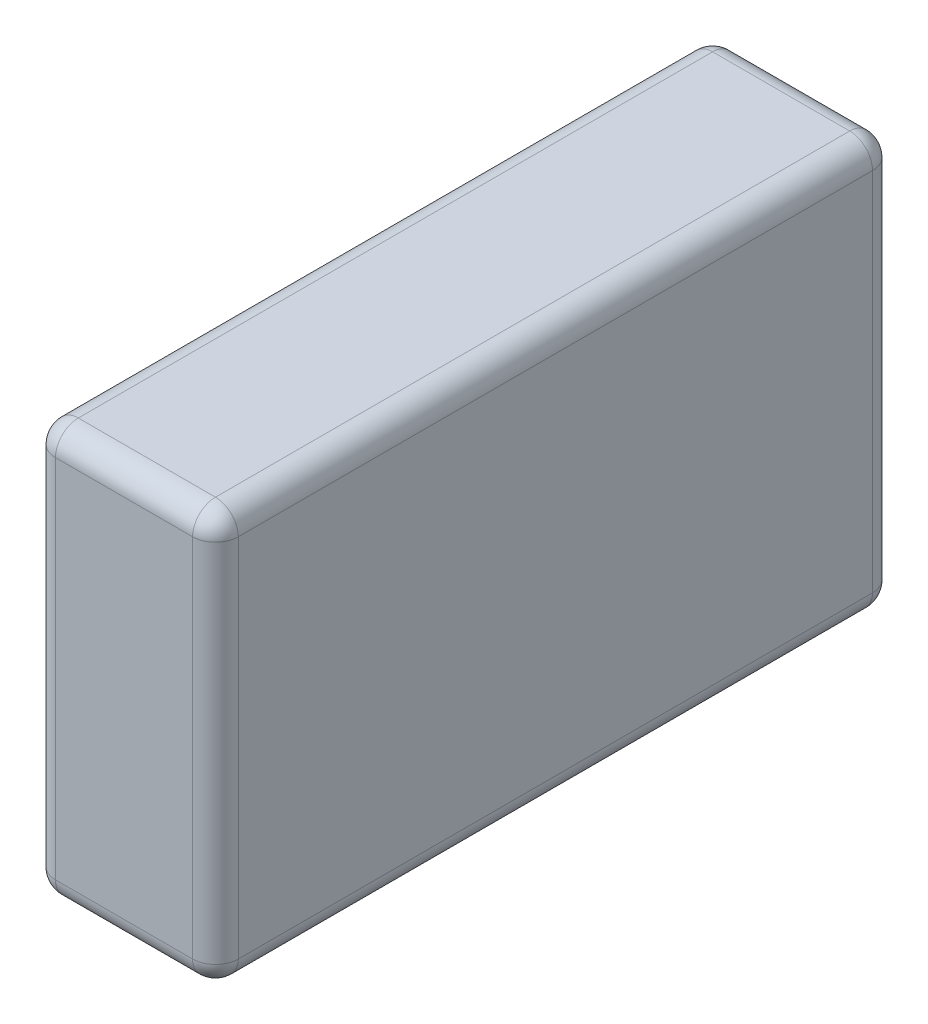
ISO-10303-21;
HEADER;
FILE_DESCRIPTION(('STEP AP214'),'2;1');
FILE_NAME('part.step','',(''),(''),'','','');
FILE_SCHEMA(('AUTOMOTIVE_DESIGN { 1 0 10303 214 1 1 1 1 }'));
ENDSEC;
DATA;
#1=APPLICATION_CONTEXT('core data for automotive mechanical design processes');
#2=APPLICATION_PROTOCOL_DEFINITION('international standard','automotive_design',2000,#1);
#3=PRODUCT_CONTEXT('',#1,'mechanical');
#4=PRODUCT('Part','Part','',(#3));
#5=PRODUCT_RELATED_PRODUCT_CATEGORY('part','',(#4));
#6=PRODUCT_DEFINITION_FORMATION('','',#4);
#7=PRODUCT_DEFINITION_CONTEXT('part definition',#1,'design');
#8=PRODUCT_DEFINITION('design','',#6,#7);
#9=PRODUCT_DEFINITION_SHAPE('','',#8);
#10=(LENGTH_UNIT() NAMED_UNIT(*) SI_UNIT(.MILLI.,.METRE.));
#11=(NAMED_UNIT(*) PLANE_ANGLE_UNIT() SI_UNIT($,.RADIAN.));
#12=(NAMED_UNIT(*) SI_UNIT($,.STERADIAN.) SOLID_ANGLE_UNIT());
#13=UNCERTAINTY_MEASURE_WITH_UNIT(LENGTH_MEASURE(1.E-05),#10,'distance_accuracy_value','');
#14=(GEOMETRIC_REPRESENTATION_CONTEXT(3) GLOBAL_UNCERTAINTY_ASSIGNED_CONTEXT((#13)) GLOBAL_UNIT_ASSIGNED_CONTEXT((#10,
#11,#12)) REPRESENTATION_CONTEXT('',''));
#15=CARTESIAN_POINT('',(0.,0.,0.));
#16=DIRECTION('',(0.,0.,1.));
#17=DIRECTION('',(1.,0.,0.));
#18=AXIS2_PLACEMENT_3D('',#15,#16,#17);
#19=CARTESIAN_POINT('',(32.,36.,59.));
#20=DIRECTION('',(0.,0.,-1.));
#21=DIRECTION('',(0.,1.,0.));
#22=AXIS2_PLACEMENT_3D('',#19,#20,#21);
#23=PLANE('',#22);
#24=DIRECTION('',(0.,-1.,0.));
#25=VECTOR('',#24,1.);
#26=CARTESIAN_POINT('',(4.,36.,59.));
#27=LINE('',#26,#25);
#28=CARTESIAN_POINT('',(4.,32.,59.));
#29=VERTEX_POINT('',#28);
#30=CARTESIAN_POINT('',(4.,-32.,59.));
#31=VERTEX_POINT('',#30);
#32=EDGE_CURVE('E336',#29,#31,#27,.T.);
#33=ORIENTED_EDGE('',*,*,#32,.T.);
#34=DIRECTION('',(-1.,0.,0.));
#35=VECTOR('',#34,1.);
#36=CARTESIAN_POINT('',(32.,-32.,59.));
#37=LINE('',#36,#35);
#38=CARTESIAN_POINT('',(28.,-32.,59.));
#39=VERTEX_POINT('',#38);
#40=EDGE_CURVE('E256',#31,#39,#37,.F.);
#41=ORIENTED_EDGE('',*,*,#40,.T.);
#42=DIRECTION('',(0.,-1.,0.));
#43=VECTOR('',#42,1.);
#44=CARTESIAN_POINT('',(28.,36.,59.));
#45=LINE('',#44,#43);
#46=CARTESIAN_POINT('',(28.,32.,59.));
#47=VERTEX_POINT('',#46);
#48=EDGE_CURVE('E243',#39,#47,#45,.F.);
#49=ORIENTED_EDGE('',*,*,#48,.T.);
#50=DIRECTION('',(-1.,0.,0.));
#51=VECTOR('',#50,1.);
#52=CARTESIAN_POINT('',(32.,32.,59.));
#53=LINE('',#52,#51);
#54=EDGE_CURVE('E331',#47,#29,#53,.T.);
#55=ORIENTED_EDGE('',*,*,#54,.T.);
#56=EDGE_LOOP('',(#33,#41,#49,#55));
#57=FACE_BOUND('',#56,.T.);
#58=ADVANCED_FACE('F45',(#57),#23,.F.);
#59=CARTESIAN_POINT('',(32.,-36.,59.));
#60=DIRECTION('',(0.,1.,0.));
#61=DIRECTION('',(0.,0.,1.));
#62=AXIS2_PLACEMENT_3D('',#59,#60,#61);
#63=PLANE('',#62);
#64=DIRECTION('',(0.,0.,-1.));
#65=VECTOR('',#64,1.);
#66=CARTESIAN_POINT('',(4.,-36.,59.));
#67=LINE('',#66,#65);
#68=CARTESIAN_POINT('',(4.,-36.,55.));
#69=VERTEX_POINT('',#68);
#70=CARTESIAN_POINT('',(4.,-36.,-56.));
#71=VERTEX_POINT('',#70);
#72=EDGE_CURVE('E309',#69,#71,#67,.T.);
#73=ORIENTED_EDGE('',*,*,#72,.T.);
#74=DIRECTION('',(-1.,0.,0.));
#75=VECTOR('',#74,1.);
#76=CARTESIAN_POINT('',(32.,-36.,-56.));
#77=LINE('',#76,#75);
#78=CARTESIAN_POINT('',(28.,-36.,-56.));
#79=VERTEX_POINT('',#78);
#80=EDGE_CURVE('E306',#71,#79,#77,.F.);
#81=ORIENTED_EDGE('',*,*,#80,.T.);
#82=DIRECTION('',(0.,0.,-1.));
#83=VECTOR('',#82,1.);
#84=CARTESIAN_POINT('',(28.,-36.,59.));
#85=LINE('',#84,#83);
#86=CARTESIAN_POINT('',(28.,-36.,55.));
#87=VERTEX_POINT('',#86);
#88=EDGE_CURVE('E297',#79,#87,#85,.F.);
#89=ORIENTED_EDGE('',*,*,#88,.T.);
#90=DIRECTION('',(-1.,0.,0.));
#91=VECTOR('',#90,1.);
#92=CARTESIAN_POINT('',(32.,-36.,55.));
#93=LINE('',#92,#91);
#94=EDGE_CURVE('E303',#87,#69,#93,.T.);
#95=ORIENTED_EDGE('',*,*,#94,.T.);
#96=EDGE_LOOP('',(#73,#81,#89,#95));
#97=FACE_BOUND('',#96,.T.);
#98=ADVANCED_FACE('F307',(#97),#63,.F.);
#99=CARTESIAN_POINT('',(32.,36.,-60.));
#100=DIRECTION('',(0.,0.,1.));
#101=DIRECTION('',(1.,0.,0.));
#102=AXIS2_PLACEMENT_3D('',#99,#100,#101);
#103=PLANE('',#102);
#104=DIRECTION('',(0.,1.,0.));
#105=VECTOR('',#104,1.);
#106=CARTESIAN_POINT('',(28.,-36.,-60.));
#107=LINE('',#106,#105);
#108=CARTESIAN_POINT('',(28.,32.,-60.));
#109=VERTEX_POINT('',#108);
#110=CARTESIAN_POINT('',(28.,-32.,-60.));
#111=VERTEX_POINT('',#110);
#112=EDGE_CURVE('E146',#109,#111,#107,.F.);
#113=ORIENTED_EDGE('',*,*,#112,.T.);
#114=DIRECTION('',(-1.,0.,0.));
#115=VECTOR('',#114,1.);
#116=CARTESIAN_POINT('',(32.,-32.,-60.));
#117=LINE('',#116,#115);
#118=CARTESIAN_POINT('',(4.,-32.,-60.));
#119=VERTEX_POINT('',#118);
#120=EDGE_CURVE('E141',#111,#119,#117,.T.);
#121=ORIENTED_EDGE('',*,*,#120,.T.);
#122=DIRECTION('',(0.,1.,0.));
#123=VECTOR('',#122,1.);
#124=CARTESIAN_POINT('',(4.,36.,-60.));
#125=LINE('',#124,#123);
#126=CARTESIAN_POINT('',(4.,32.,-60.));
#127=VERTEX_POINT('',#126);
#128=EDGE_CURVE('E135',#119,#127,#125,.T.);
#129=ORIENTED_EDGE('',*,*,#128,.T.);
#130=DIRECTION('',(-1.,0.,0.));
#131=VECTOR('',#130,1.);
#132=CARTESIAN_POINT('',(32.,32.,-60.));
#133=LINE('',#132,#131);
#134=EDGE_CURVE('E138',#127,#109,#133,.F.);
#135=ORIENTED_EDGE('',*,*,#134,.T.);
#136=EDGE_LOOP('',(#113,#121,#129,#135));
#137=FACE_BOUND('',#136,.T.);
#138=ADVANCED_FACE('F137',(#137),#103,.F.);
#139=CARTESIAN_POINT('',(32.,36.,59.));
#140=DIRECTION('',(0.,-1.,0.));
#141=DIRECTION('',(0.,0.,-1.));
#142=AXIS2_PLACEMENT_3D('',#139,#140,#141);
#143=PLANE('',#142);
#144=DIRECTION('',(0.,0.,1.));
#145=VECTOR('',#144,1.);
#146=CARTESIAN_POINT('',(28.,36.,-60.));
#147=LINE('',#146,#145);
#148=CARTESIAN_POINT('',(28.,36.,55.));
#149=VERTEX_POINT('',#148);
#150=CARTESIAN_POINT('',(28.,36.,-56.));
#151=VERTEX_POINT('',#150);
#152=EDGE_CURVE('E55',#149,#151,#147,.F.);
#153=ORIENTED_EDGE('',*,*,#152,.T.);
#154=DIRECTION('',(-1.,0.,0.));
#155=VECTOR('',#154,1.);
#156=CARTESIAN_POINT('',(32.,36.,-56.));
#157=LINE('',#156,#155);
#158=CARTESIAN_POINT('',(4.,36.,-56.));
#159=VERTEX_POINT('',#158);
#160=EDGE_CURVE('E11',#151,#159,#157,.T.);
#161=ORIENTED_EDGE('',*,*,#160,.T.);
#162=DIRECTION('',(0.,0.,1.));
#163=VECTOR('',#162,1.);
#164=CARTESIAN_POINT('',(4.,36.,59.));
#165=LINE('',#164,#163);
#166=CARTESIAN_POINT('',(4.,36.,55.));
#167=VERTEX_POINT('',#166);
#168=EDGE_CURVE('E263',#159,#167,#165,.T.);
#169=ORIENTED_EDGE('',*,*,#168,.T.);
#170=DIRECTION('',(-1.,0.,0.));
#171=VECTOR('',#170,1.);
#172=CARTESIAN_POINT('',(32.,36.,55.));
#173=LINE('',#172,#171);
#174=EDGE_CURVE('E66',#167,#149,#173,.F.);
#175=ORIENTED_EDGE('',*,*,#174,.T.);
#176=EDGE_LOOP('',(#153,#161,#169,#175));
#177=FACE_BOUND('',#176,.T.);
#178=ADVANCED_FACE('F442',(#177),#143,.F.);
#179=CARTESIAN_POINT('',(32.,0.,0.));
#180=DIRECTION('',(1.,0.,0.));
#181=DIRECTION('',(0.,0.,-1.));
#182=AXIS2_PLACEMENT_3D('',#179,#180,#181);
#183=PLANE('',#182);
#184=DIRECTION('',(0.,0.,-1.));
#185=VECTOR('',#184,1.);
#186=CARTESIAN_POINT('',(32.,-32.,-60.));
#187=LINE('',#186,#185);
#188=CARTESIAN_POINT('',(32.,-32.,55.));
#189=VERTEX_POINT('',#188);
#190=CARTESIAN_POINT('',(32.,-32.,-56.));
#191=VERTEX_POINT('',#190);
#192=EDGE_CURVE('E249',#189,#191,#187,.T.);
#193=ORIENTED_EDGE('',*,*,#192,.T.);
#194=DIRECTION('',(0.,1.,0.));
#195=VECTOR('',#194,1.);
#196=CARTESIAN_POINT('',(32.,36.,-56.));
#197=LINE('',#196,#195);
#198=CARTESIAN_POINT('',(32.,32.,-56.));
#199=VERTEX_POINT('',#198);
#200=EDGE_CURVE('E254',#191,#199,#197,.T.);
#201=ORIENTED_EDGE('',*,*,#200,.T.);
#202=DIRECTION('',(0.,0.,1.));
#203=VECTOR('',#202,1.);
#204=CARTESIAN_POINT('',(32.,32.,59.));
#205=LINE('',#204,#203);
#206=CARTESIAN_POINT('',(32.,32.,55.));
#207=VERTEX_POINT('',#206);
#208=EDGE_CURVE('E250',#199,#207,#205,.T.);
#209=ORIENTED_EDGE('',*,*,#208,.T.);
#210=DIRECTION('',(0.,-1.,0.));
#211=VECTOR('',#210,1.);
#212=CARTESIAN_POINT('',(32.,-36.,55.));
#213=LINE('',#212,#211);
#214=EDGE_CURVE('E245',#207,#189,#213,.T.);
#215=ORIENTED_EDGE('',*,*,#214,.T.);
#216=EDGE_LOOP('',(#193,#201,#209,#215));
#217=FACE_BOUND('',#216,.T.);
#218=ADVANCED_FACE('F366',(#217),#183,.T.);
#219=CARTESIAN_POINT('',(0.,0.,0.));
#220=DIRECTION('',(1.,0.,0.));
#221=DIRECTION('',(0.,0.,-1.));
#222=AXIS2_PLACEMENT_3D('',#219,#220,#221);
#223=PLANE('',#222);
#224=DIRECTION('',(0.,1.,0.));
#225=VECTOR('',#224,1.);
#226=CARTESIAN_POINT('',(0.,0.,-56.));
#227=LINE('',#226,#225);
#228=CARTESIAN_POINT('',(0.,32.,-56.));
#229=VERTEX_POINT('',#228);
#230=CARTESIAN_POINT('',(0.,-32.,-56.));
#231=VERTEX_POINT('',#230);
#232=EDGE_CURVE('E169',#229,#231,#227,.F.);
#233=ORIENTED_EDGE('',*,*,#232,.T.);
#234=DIRECTION('',(0.,0.,-1.));
#235=VECTOR('',#234,1.);
#236=CARTESIAN_POINT('',(0.,-32.,0.));
#237=LINE('',#236,#235);
#238=CARTESIAN_POINT('',(0.,-32.,55.));
#239=VERTEX_POINT('',#238);
#240=EDGE_CURVE('E327',#231,#239,#237,.F.);
#241=ORIENTED_EDGE('',*,*,#240,.T.);
#242=DIRECTION('',(0.,-1.,0.));
#243=VECTOR('',#242,1.);
#244=CARTESIAN_POINT('',(0.,0.,55.));
#245=LINE('',#244,#243);
#246=CARTESIAN_POINT('',(0.,32.,55.));
#247=VERTEX_POINT('',#246);
#248=EDGE_CURVE('E318',#239,#247,#245,.F.);
#249=ORIENTED_EDGE('',*,*,#248,.T.);
#250=DIRECTION('',(0.,0.,1.));
#251=VECTOR('',#250,1.);
#252=CARTESIAN_POINT('',(0.,32.,0.));
#253=LINE('',#252,#251);
#254=EDGE_CURVE('E314',#247,#229,#253,.F.);
#255=ORIENTED_EDGE('',*,*,#254,.T.);
#256=EDGE_LOOP('',(#233,#241,#249,#255));
#257=FACE_BOUND('',#256,.T.);
#258=ADVANCED_FACE('F433',(#257),#223,.F.);
#259=CARTESIAN_POINT('',(32.,32.,55.));
#260=DIRECTION('',(-1.,0.,0.));
#261=DIRECTION('',(0.,0.,1.));
#262=AXIS2_PLACEMENT_3D('',#259,#260,#261);
#263=CYLINDRICAL_SURFACE('',#262,4.);
#264=CARTESIAN_POINT('',(28.,32.,55.));
#265=DIRECTION('',(1.,0.,0.));
#266=DIRECTION('',(0.,0.,-1.));
#267=AXIS2_PLACEMENT_3D('',#264,#265,#266);
#268=CIRCLE('',#267,4.);
#269=EDGE_CURVE('E49',#149,#47,#268,.T.);
#270=ORIENTED_EDGE('',*,*,#269,.F.);
#271=ORIENTED_EDGE('',*,*,#174,.F.);
#272=CARTESIAN_POINT('',(4.,32.,55.));
#273=DIRECTION('',(-1.,0.,0.));
#274=DIRECTION('',(0.,0.,1.));
#275=AXIS2_PLACEMENT_3D('',#272,#273,#274);
#276=CIRCLE('',#275,4.);
#277=EDGE_CURVE('E223',#29,#167,#276,.T.);
#278=ORIENTED_EDGE('',*,*,#277,.F.);
#279=ORIENTED_EDGE('',*,*,#54,.F.);
#280=EDGE_LOOP('',(#270,#271,#278,#279));
#281=FACE_BOUND('',#280,.T.);
#282=ADVANCED_FACE('F47',(#281),#263,.T.);
#283=CARTESIAN_POINT('',(28.,32.,55.));
#284=DIRECTION('',(0.,0.,1.));
#285=DIRECTION('',(1.,0.,0.));
#286=AXIS2_PLACEMENT_3D('',#283,#284,#285);
#287=SPHERICAL_SURFACE('',#286,4.);
#288=CARTESIAN_POINT('',(28.,32.,55.));
#289=DIRECTION('',(0.,0.,1.));
#290=DIRECTION('',(0.,-1.,0.));
#291=AXIS2_PLACEMENT_3D('',#288,#289,#290);
#292=CIRCLE('',#291,4.);
#293=EDGE_CURVE('E216',#149,#207,#292,.F.);
#294=ORIENTED_EDGE('',*,*,#293,.F.);
#295=ORIENTED_EDGE('',*,*,#269,.T.);
#296=CARTESIAN_POINT('',(28.,32.,55.));
#297=DIRECTION('',(0.,1.,0.));
#298=DIRECTION('',(0.,0.,1.));
#299=AXIS2_PLACEMENT_3D('',#296,#297,#298);
#300=CIRCLE('',#299,4.);
#301=EDGE_CURVE('E220',#207,#47,#300,.F.);
#302=ORIENTED_EDGE('',*,*,#301,.F.);
#303=EDGE_LOOP('',(#294,#295,#302));
#304=FACE_BOUND('',#303,.T.);
#305=ADVANCED_FACE('F235',(#304),#287,.T.);
#306=CARTESIAN_POINT('',(4.,32.,55.));
#307=DIRECTION('',(0.,1.,0.));
#308=DIRECTION('',(0.,0.,1.));
#309=AXIS2_PLACEMENT_3D('',#306,#307,#308);
#310=SPHERICAL_SURFACE('',#309,4.);
#311=CARTESIAN_POINT('',(4.,32.,55.));
#312=DIRECTION('',(0.,1.,0.));
#313=DIRECTION('',(0.,0.,1.));
#314=AXIS2_PLACEMENT_3D('',#311,#312,#313);
#315=CIRCLE('',#314,4.);
#316=EDGE_CURVE('E208',#29,#247,#315,.F.);
#317=ORIENTED_EDGE('',*,*,#316,.F.);
#318=ORIENTED_EDGE('',*,*,#277,.T.);
#319=CARTESIAN_POINT('',(4.,32.,55.));
#320=DIRECTION('',(0.,0.,1.));
#321=DIRECTION('',(1.,0.,0.));
#322=AXIS2_PLACEMENT_3D('',#319,#320,#321);
#323=CIRCLE('',#322,4.);
#324=EDGE_CURVE('E212',#247,#167,#323,.F.);
#325=ORIENTED_EDGE('',*,*,#324,.F.);
#326=EDGE_LOOP('',(#317,#318,#325));
#327=FACE_BOUND('',#326,.T.);
#328=ADVANCED_FACE('F384',(#327),#310,.T.);
#329=CARTESIAN_POINT('',(28.,0.,55.));
#330=DIRECTION('',(0.,1.,0.));
#331=DIRECTION('',(0.,0.,1.));
#332=AXIS2_PLACEMENT_3D('',#329,#330,#331);
#333=CYLINDRICAL_SURFACE('',#332,4.);
#334=ORIENTED_EDGE('',*,*,#301,.T.);
#335=ORIENTED_EDGE('',*,*,#48,.F.);
#336=CARTESIAN_POINT('',(28.,-32.,55.));
#337=DIRECTION('',(0.,-1.,0.));
#338=DIRECTION('',(0.,0.,-1.));
#339=AXIS2_PLACEMENT_3D('',#336,#337,#338);
#340=CIRCLE('',#339,4.);
#341=EDGE_CURVE('E201',#189,#39,#340,.T.);
#342=ORIENTED_EDGE('',*,*,#341,.F.);
#343=ORIENTED_EDGE('',*,*,#214,.F.);
#344=EDGE_LOOP('',(#334,#335,#342,#343));
#345=FACE_BOUND('',#344,.T.);
#346=ADVANCED_FACE('F241',(#345),#333,.T.);
#347=CARTESIAN_POINT('',(28.,32.,0.));
#348=DIRECTION('',(0.,0.,-1.));
#349=DIRECTION('',(-1.,0.,0.));
#350=AXIS2_PLACEMENT_3D('',#347,#348,#349);
#351=CYLINDRICAL_SURFACE('',#350,4.);
#352=ORIENTED_EDGE('',*,*,#293,.T.);
#353=ORIENTED_EDGE('',*,*,#208,.F.);
#354=CARTESIAN_POINT('',(28.,32.,-56.));
#355=DIRECTION('',(0.,0.,-1.));
#356=DIRECTION('',(-1.,0.,0.));
#357=AXIS2_PLACEMENT_3D('',#354,#355,#356);
#358=CIRCLE('',#357,4.);
#359=EDGE_CURVE('E197',#151,#199,#358,.T.);
#360=ORIENTED_EDGE('',*,*,#359,.F.);
#361=ORIENTED_EDGE('',*,*,#152,.F.);
#362=EDGE_LOOP('',(#352,#353,#360,#361));
#363=FACE_BOUND('',#362,.T.);
#364=ADVANCED_FACE('F375',(#363),#351,.T.);
#365=CARTESIAN_POINT('',(32.,32.,-56.));
#366=DIRECTION('',(-1.,0.,0.));
#367=DIRECTION('',(0.,0.,1.));
#368=AXIS2_PLACEMENT_3D('',#365,#366,#367);
#369=CYLINDRICAL_SURFACE('',#368,4.);
#370=CARTESIAN_POINT('',(4.,32.,-56.));
#371=DIRECTION('',(-1.,0.,0.));
#372=DIRECTION('',(0.,0.,1.));
#373=AXIS2_PLACEMENT_3D('',#370,#371,#372);
#374=CIRCLE('',#373,4.);
#375=EDGE_CURVE('E152',#159,#127,#374,.T.);
#376=ORIENTED_EDGE('',*,*,#375,.F.);
#377=ORIENTED_EDGE('',*,*,#160,.F.);
#378=CARTESIAN_POINT('',(28.,32.,-56.));
#379=DIRECTION('',(1.,0.,0.));
#380=DIRECTION('',(0.,0.,-1.));
#381=AXIS2_PLACEMENT_3D('',#378,#379,#380);
#382=CIRCLE('',#381,4.);
#383=EDGE_CURVE('E155',#109,#151,#382,.T.);
#384=ORIENTED_EDGE('',*,*,#383,.F.);
#385=ORIENTED_EDGE('',*,*,#134,.F.);
#386=EDGE_LOOP('',(#376,#377,#384,#385));
#387=FACE_BOUND('',#386,.T.);
#388=ADVANCED_FACE('F151',(#387),#369,.T.);
#389=CARTESIAN_POINT('',(4.,32.,59.));
#390=DIRECTION('',(0.,0.,1.));
#391=DIRECTION('',(1.,0.,0.));
#392=AXIS2_PLACEMENT_3D('',#389,#390,#391);
#393=CYLINDRICAL_SURFACE('',#392,4.);
#394=ORIENTED_EDGE('',*,*,#324,.T.);
#395=ORIENTED_EDGE('',*,*,#168,.F.);
#396=CARTESIAN_POINT('',(4.,32.,-56.));
#397=DIRECTION('',(0.,0.,-1.));
#398=DIRECTION('',(-1.,0.,0.));
#399=AXIS2_PLACEMENT_3D('',#396,#397,#398);
#400=CIRCLE('',#399,4.);
#401=EDGE_CURVE('E165',#229,#159,#400,.T.);
#402=ORIENTED_EDGE('',*,*,#401,.F.);
#403=ORIENTED_EDGE('',*,*,#254,.F.);
#404=EDGE_LOOP('',(#394,#395,#402,#403));
#405=FACE_BOUND('',#404,.T.);
#406=ADVANCED_FACE('F382',(#405),#393,.T.);
#407=CARTESIAN_POINT('',(4.,36.,55.));
#408=DIRECTION('',(0.,-1.,0.));
#409=DIRECTION('',(0.,0.,-1.));
#410=AXIS2_PLACEMENT_3D('',#407,#408,#409);
#411=CYLINDRICAL_SURFACE('',#410,4.);
#412=ORIENTED_EDGE('',*,*,#316,.T.);
#413=ORIENTED_EDGE('',*,*,#248,.F.);
#414=CARTESIAN_POINT('',(4.,-32.,55.));
#415=DIRECTION('',(0.,-1.,0.));
#416=DIRECTION('',(0.,0.,-1.));
#417=AXIS2_PLACEMENT_3D('',#414,#415,#416);
#418=CIRCLE('',#417,4.);
#419=EDGE_CURVE('E189',#31,#239,#418,.T.);
#420=ORIENTED_EDGE('',*,*,#419,.F.);
#421=ORIENTED_EDGE('',*,*,#32,.F.);
#422=EDGE_LOOP('',(#412,#413,#420,#421));
#423=FACE_BOUND('',#422,.T.);
#424=ADVANCED_FACE('F350',(#423),#411,.T.);
#425=CARTESIAN_POINT('',(32.,-32.,55.));
#426=DIRECTION('',(-1.,0.,0.));
#427=DIRECTION('',(0.,0.,1.));
#428=AXIS2_PLACEMENT_3D('',#425,#426,#427);
#429=CYLINDRICAL_SURFACE('',#428,4.);
#430=CARTESIAN_POINT('',(28.,-32.,55.));
#431=DIRECTION('',(1.,0.,0.));
#432=DIRECTION('',(0.,0.,-1.));
#433=AXIS2_PLACEMENT_3D('',#430,#431,#432);
#434=CIRCLE('',#433,4.);
#435=EDGE_CURVE('E204',#39,#87,#434,.T.);
#436=ORIENTED_EDGE('',*,*,#435,.F.);
#437=ORIENTED_EDGE('',*,*,#40,.F.);
#438=CARTESIAN_POINT('',(4.,-32.,55.));
#439=DIRECTION('',(-1.,0.,0.));
#440=DIRECTION('',(0.,0.,1.));
#441=AXIS2_PLACEMENT_3D('',#438,#439,#440);
#442=CIRCLE('',#441,4.);
#443=EDGE_CURVE('E185',#69,#31,#442,.T.);
#444=ORIENTED_EDGE('',*,*,#443,.F.);
#445=ORIENTED_EDGE('',*,*,#94,.F.);
#446=EDGE_LOOP('',(#436,#437,#444,#445));
#447=FACE_BOUND('',#446,.T.);
#448=ADVANCED_FACE('F346',(#447),#429,.T.);
#449=CARTESIAN_POINT('',(28.,-32.,55.));
#450=DIRECTION('',(0.,0.,1.));
#451=DIRECTION('',(1.,0.,0.));
#452=AXIS2_PLACEMENT_3D('',#449,#450,#451);
#453=SPHERICAL_SURFACE('',#452,4.);
#454=ORIENTED_EDGE('',*,*,#341,.T.);
#455=ORIENTED_EDGE('',*,*,#435,.T.);
#456=CARTESIAN_POINT('',(28.,-32.,55.));
#457=DIRECTION('',(0.,0.,1.));
#458=DIRECTION('',(1.,0.,0.));
#459=AXIS2_PLACEMENT_3D('',#456,#457,#458);
#460=CIRCLE('',#459,4.);
#461=EDGE_CURVE('E176',#189,#87,#460,.F.);
#462=ORIENTED_EDGE('',*,*,#461,.F.);
#463=EDGE_LOOP('',(#454,#455,#462));
#464=FACE_BOUND('',#463,.T.);
#465=ADVANCED_FACE('F364',(#464),#453,.T.);
#466=CARTESIAN_POINT('',(28.,32.,-56.));
#467=DIRECTION('',(0.,1.,0.));
#468=DIRECTION('',(0.,0.,1.));
#469=AXIS2_PLACEMENT_3D('',#466,#467,#468);
#470=SPHERICAL_SURFACE('',#469,4.);
#471=ORIENTED_EDGE('',*,*,#383,.T.);
#472=ORIENTED_EDGE('',*,*,#359,.T.);
#473=CARTESIAN_POINT('',(28.,32.,-56.));
#474=DIRECTION('',(0.,1.,0.));
#475=DIRECTION('',(0.,0.,1.));
#476=AXIS2_PLACEMENT_3D('',#473,#474,#475);
#477=CIRCLE('',#476,4.);
#478=EDGE_CURVE('E171',#109,#199,#477,.F.);
#479=ORIENTED_EDGE('',*,*,#478,.F.);
#480=EDGE_LOOP('',(#471,#472,#479));
#481=FACE_BOUND('',#480,.T.);
#482=ADVANCED_FACE('F373',(#481),#470,.T.);
#483=CARTESIAN_POINT('',(4.,32.,-56.));
#484=DIRECTION('',(0.,1.,0.));
#485=DIRECTION('',(0.,0.,1.));
#486=AXIS2_PLACEMENT_3D('',#483,#484,#485);
#487=SPHERICAL_SURFACE('',#486,4.);
#488=ORIENTED_EDGE('',*,*,#401,.T.);
#489=ORIENTED_EDGE('',*,*,#375,.T.);
#490=CARTESIAN_POINT('',(4.,32.,-56.));
#491=DIRECTION('',(0.,1.,0.));
#492=DIRECTION('',(0.,0.,1.));
#493=AXIS2_PLACEMENT_3D('',#490,#491,#492);
#494=CIRCLE('',#493,4.);
#495=EDGE_CURVE('E162',#229,#127,#494,.F.);
#496=ORIENTED_EDGE('',*,*,#495,.F.);
#497=EDGE_LOOP('',(#488,#489,#496));
#498=FACE_BOUND('',#497,.T.);
#499=ADVANCED_FACE('F161',(#498),#487,.T.);
#500=CARTESIAN_POINT('',(4.,-32.,55.));
#501=DIRECTION('',(0.,0.,1.));
#502=DIRECTION('',(1.,0.,0.));
#503=AXIS2_PLACEMENT_3D('',#500,#501,#502);
#504=SPHERICAL_SURFACE('',#503,4.);
#505=ORIENTED_EDGE('',*,*,#443,.T.);
#506=ORIENTED_EDGE('',*,*,#419,.T.);
#507=CARTESIAN_POINT('',(4.,-32.,55.));
#508=DIRECTION('',(0.,0.,1.));
#509=DIRECTION('',(1.,0.,0.));
#510=AXIS2_PLACEMENT_3D('',#507,#508,#509);
#511=CIRCLE('',#510,4.);
#512=EDGE_CURVE('E172',#69,#239,#511,.F.);
#513=ORIENTED_EDGE('',*,*,#512,.F.);
#514=EDGE_LOOP('',(#505,#506,#513));
#515=FACE_BOUND('',#514,.T.);
#516=ADVANCED_FACE('F352',(#515),#504,.T.);
#517=CARTESIAN_POINT('',(28.,-32.,0.));
#518=DIRECTION('',(0.,0.,1.));
#519=DIRECTION('',(1.,0.,0.));
#520=AXIS2_PLACEMENT_3D('',#517,#518,#519);
#521=CYLINDRICAL_SURFACE('',#520,4.);
#522=ORIENTED_EDGE('',*,*,#461,.T.);
#523=ORIENTED_EDGE('',*,*,#88,.F.);
#524=CARTESIAN_POINT('',(28.,-32.,-56.));
#525=DIRECTION('',(0.,0.,-1.));
#526=DIRECTION('',(-1.,0.,0.));
#527=AXIS2_PLACEMENT_3D('',#524,#525,#526);
#528=CIRCLE('',#527,4.);
#529=EDGE_CURVE('E178',#191,#79,#528,.T.);
#530=ORIENTED_EDGE('',*,*,#529,.F.);
#531=ORIENTED_EDGE('',*,*,#192,.F.);
#532=EDGE_LOOP('',(#522,#523,#530,#531));
#533=FACE_BOUND('',#532,.T.);
#534=ADVANCED_FACE('F299',(#533),#521,.T.);
#535=CARTESIAN_POINT('',(28.,0.,-56.));
#536=DIRECTION('',(0.,-1.,0.));
#537=DIRECTION('',(0.,0.,-1.));
#538=AXIS2_PLACEMENT_3D('',#535,#536,#537);
#539=CYLINDRICAL_SURFACE('',#538,4.);
#540=ORIENTED_EDGE('',*,*,#478,.T.);
#541=ORIENTED_EDGE('',*,*,#200,.F.);
#542=CARTESIAN_POINT('',(28.,-32.,-56.));
#543=DIRECTION('',(0.,-1.,0.));
#544=DIRECTION('',(1.,0.,0.));
#545=AXIS2_PLACEMENT_3D('',#542,#543,#544);
#546=CIRCLE('',#545,4.);
#547=EDGE_CURVE('E284',#111,#191,#546,.T.);
#548=ORIENTED_EDGE('',*,*,#547,.F.);
#549=ORIENTED_EDGE('',*,*,#112,.F.);
#550=EDGE_LOOP('',(#540,#541,#548,#549));
#551=FACE_BOUND('',#550,.T.);
#552=ADVANCED_FACE('F368',(#551),#539,.T.);
#553=CARTESIAN_POINT('',(4.,36.,-56.));
#554=DIRECTION('',(0.,1.,0.));
#555=DIRECTION('',(0.,0.,1.));
#556=AXIS2_PLACEMENT_3D('',#553,#554,#555);
#557=CYLINDRICAL_SURFACE('',#556,4.);
#558=ORIENTED_EDGE('',*,*,#495,.T.);
#559=ORIENTED_EDGE('',*,*,#128,.F.);
#560=CARTESIAN_POINT('',(4.,-32.,-56.));
#561=DIRECTION('',(0.,-1.,0.));
#562=DIRECTION('',(0.,0.,-1.));
#563=AXIS2_PLACEMENT_3D('',#560,#561,#562);
#564=CIRCLE('',#563,4.);
#565=EDGE_CURVE('E280',#231,#119,#564,.T.);
#566=ORIENTED_EDGE('',*,*,#565,.F.);
#567=ORIENTED_EDGE('',*,*,#232,.F.);
#568=EDGE_LOOP('',(#558,#559,#566,#567));
#569=FACE_BOUND('',#568,.T.);
#570=ADVANCED_FACE('F168',(#569),#557,.T.);
#571=CARTESIAN_POINT('',(4.,-32.,59.));
#572=DIRECTION('',(0.,0.,-1.));
#573=DIRECTION('',(-1.,0.,0.));
#574=AXIS2_PLACEMENT_3D('',#571,#572,#573);
#575=CYLINDRICAL_SURFACE('',#574,4.);
#576=ORIENTED_EDGE('',*,*,#512,.T.);
#577=ORIENTED_EDGE('',*,*,#240,.F.);
#578=CARTESIAN_POINT('',(4.,-32.,-56.));
#579=DIRECTION('',(0.,0.,-1.));
#580=DIRECTION('',(-1.,0.,0.));
#581=AXIS2_PLACEMENT_3D('',#578,#579,#580);
#582=CIRCLE('',#581,4.);
#583=EDGE_CURVE('E276',#71,#231,#582,.T.);
#584=ORIENTED_EDGE('',*,*,#583,.F.);
#585=ORIENTED_EDGE('',*,*,#72,.F.);
#586=EDGE_LOOP('',(#576,#577,#584,#585));
#587=FACE_BOUND('',#586,.T.);
#588=ADVANCED_FACE('F355',(#587),#575,.T.);
#589=CARTESIAN_POINT('',(28.,-32.,-56.));
#590=DIRECTION('',(1.,0.,0.));
#591=DIRECTION('',(0.,0.,-1.));
#592=AXIS2_PLACEMENT_3D('',#589,#590,#591);
#593=SPHERICAL_SURFACE('',#592,4.);
#594=ORIENTED_EDGE('',*,*,#547,.T.);
#595=ORIENTED_EDGE('',*,*,#529,.T.);
#596=CARTESIAN_POINT('',(28.,-32.,-56.));
#597=DIRECTION('',(1.,0.,0.));
#598=DIRECTION('',(0.,0.,-1.));
#599=AXIS2_PLACEMENT_3D('',#596,#597,#598);
#600=CIRCLE('',#599,4.);
#601=EDGE_CURVE('E273',#111,#79,#600,.F.);
#602=ORIENTED_EDGE('',*,*,#601,.F.);
#603=EDGE_LOOP('',(#594,#595,#602));
#604=FACE_BOUND('',#603,.T.);
#605=ADVANCED_FACE('F293',(#604),#593,.T.);
#606=CARTESIAN_POINT('',(4.,-32.,-56.));
#607=DIRECTION('',(-1.,0.,0.));
#608=DIRECTION('',(0.,0.,1.));
#609=AXIS2_PLACEMENT_3D('',#606,#607,#608);
#610=SPHERICAL_SURFACE('',#609,4.);
#611=ORIENTED_EDGE('',*,*,#583,.T.);
#612=ORIENTED_EDGE('',*,*,#565,.T.);
#613=CARTESIAN_POINT('',(4.,-32.,-56.));
#614=DIRECTION('',(-1.,0.,0.));
#615=DIRECTION('',(0.,0.,1.));
#616=AXIS2_PLACEMENT_3D('',#613,#614,#615);
#617=CIRCLE('',#616,4.);
#618=EDGE_CURVE('E270',#71,#119,#617,.F.);
#619=ORIENTED_EDGE('',*,*,#618,.F.);
#620=EDGE_LOOP('',(#611,#612,#619));
#621=FACE_BOUND('',#620,.T.);
#622=ADVANCED_FACE('F357',(#621),#610,.T.);
#623=CARTESIAN_POINT('',(32.,-32.,-56.));
#624=DIRECTION('',(-1.,0.,0.));
#625=DIRECTION('',(0.,0.,1.));
#626=AXIS2_PLACEMENT_3D('',#623,#624,#625);
#627=CYLINDRICAL_SURFACE('',#626,4.);
#628=ORIENTED_EDGE('',*,*,#601,.T.);
#629=ORIENTED_EDGE('',*,*,#80,.F.);
#630=ORIENTED_EDGE('',*,*,#618,.T.);
#631=ORIENTED_EDGE('',*,*,#120,.F.);
#632=EDGE_LOOP('',(#628,#629,#630,#631));
#633=FACE_BOUND('',#632,.T.);
#634=ADVANCED_FACE('F358',(#633),#627,.T.);
#635=CLOSED_SHELL('',(#58,#98,#138,#178,#218,#258,#282,#305,#328,#346,#364,#388,#406,#424,#448,
#465,#482,#499,#516,#534,#552,#570,#588,#605,#622,#634));
#636=MANIFOLD_SOLID_BREP('B2',#635);
#637=ADVANCED_BREP_SHAPE_REPRESENTATION('',(#18,#636),#14);
#638=SHAPE_DEFINITION_REPRESENTATION(#9,#637);
ENDSEC;
END-ISO-10303-21;
